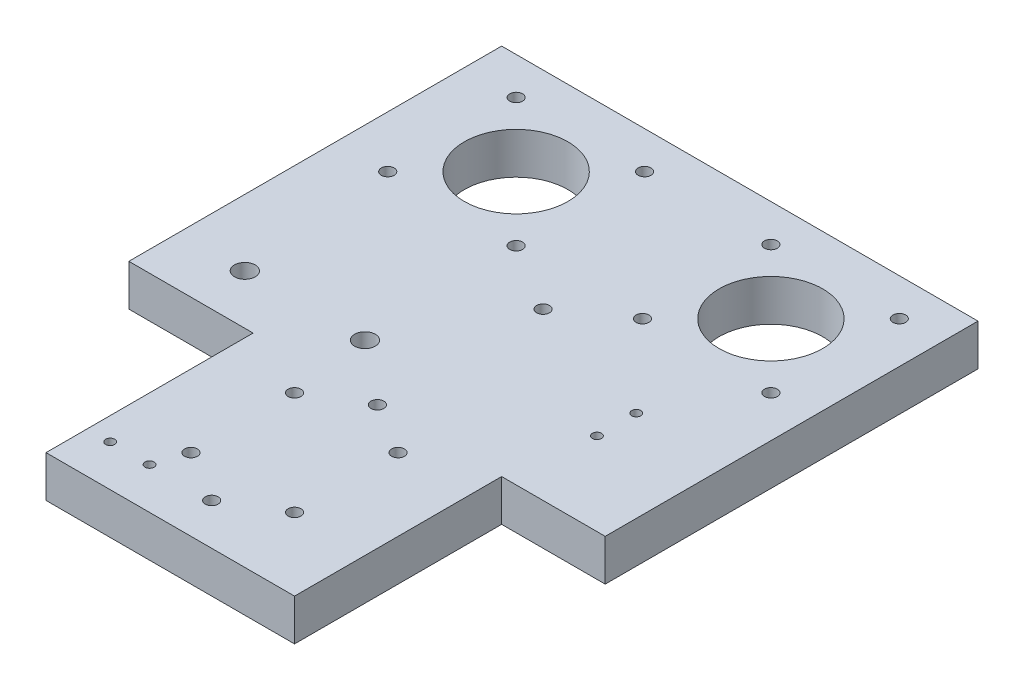
ISO-10303-21;
HEADER;
FILE_DESCRIPTION(('STEP AP214'),'2;1');
FILE_NAME('part.step','',(''),(''),'','','');
FILE_SCHEMA(('AUTOMOTIVE_DESIGN { 1 0 10303 214 1 1 1 1 }'));
ENDSEC;
DATA;
#1=APPLICATION_CONTEXT('core data for automotive mechanical design processes');
#2=APPLICATION_PROTOCOL_DEFINITION('international standard','automotive_design',2000,#1);
#3=PRODUCT_CONTEXT('',#1,'mechanical');
#4=PRODUCT('Part','Part','',(#3));
#5=PRODUCT_RELATED_PRODUCT_CATEGORY('part','',(#4));
#6=PRODUCT_DEFINITION_FORMATION('','',#4);
#7=PRODUCT_DEFINITION_CONTEXT('part definition',#1,'design');
#8=PRODUCT_DEFINITION('design','',#6,#7);
#9=PRODUCT_DEFINITION_SHAPE('','',#8);
#10=(LENGTH_UNIT() NAMED_UNIT(*) SI_UNIT(.MILLI.,.METRE.));
#11=(NAMED_UNIT(*) PLANE_ANGLE_UNIT() SI_UNIT($,.RADIAN.));
#12=(NAMED_UNIT(*) SI_UNIT($,.STERADIAN.) SOLID_ANGLE_UNIT());
#13=UNCERTAINTY_MEASURE_WITH_UNIT(LENGTH_MEASURE(1.E-05),#10,'distance_accuracy_value','');
#14=(GEOMETRIC_REPRESENTATION_CONTEXT(3) GLOBAL_UNCERTAINTY_ASSIGNED_CONTEXT((#13)) GLOBAL_UNIT_ASSIGNED_CONTEXT((#10,
#11,#12)) REPRESENTATION_CONTEXT('',''));
#15=CARTESIAN_POINT('',(0.,0.,0.));
#16=DIRECTION('',(0.,0.,1.));
#17=DIRECTION('',(1.,0.,0.));
#18=AXIS2_PLACEMENT_3D('',#15,#16,#17);
#19=CARTESIAN_POINT('',(-30.,10.,70.));
#20=DIRECTION('',(1.,0.,0.));
#21=DIRECTION('',(0.,0.,-1.));
#22=AXIS2_PLACEMENT_3D('',#19,#20,#21);
#23=PLANE('',#22);
#24=DIRECTION('',(0.,1.,0.));
#25=VECTOR('',#24,1.);
#26=CARTESIAN_POINT('',(-30.,-94.8683298050514,20.));
#27=LINE('',#26,#25);
#28=CARTESIAN_POINT('',(-30.,0.,20.));
#29=VERTEX_POINT('',#28);
#30=CARTESIAN_POINT('',(-30.,10.,20.));
#31=VERTEX_POINT('',#30);
#32=EDGE_CURVE('E47',#29,#31,#27,.T.);
#33=ORIENTED_EDGE('',*,*,#32,.F.);
#34=DIRECTION('',(0.,0.,1.));
#35=VECTOR('',#34,1.);
#36=CARTESIAN_POINT('',(-30.,0.,70.));
#37=LINE('',#36,#35);
#38=CARTESIAN_POINT('',(-30.,0.,70.));
#39=VERTEX_POINT('',#38);
#40=EDGE_CURVE('E108',#29,#39,#37,.T.);
#41=ORIENTED_EDGE('',*,*,#40,.T.);
#42=DIRECTION('',(0.,-1.,0.));
#43=VECTOR('',#42,1.);
#44=CARTESIAN_POINT('',(-30.,10.,70.));
#45=LINE('',#44,#43);
#46=CARTESIAN_POINT('',(-30.,10.,70.));
#47=VERTEX_POINT('',#46);
#48=EDGE_CURVE('E11',#47,#39,#45,.T.);
#49=ORIENTED_EDGE('',*,*,#48,.F.);
#50=DIRECTION('',(0.,0.,1.));
#51=VECTOR('',#50,1.);
#52=CARTESIAN_POINT('',(-30.,10.,70.));
#53=LINE('',#52,#51);
#54=EDGE_CURVE('E223',#31,#47,#53,.T.);
#55=ORIENTED_EDGE('',*,*,#54,.F.);
#56=EDGE_LOOP('',(#33,#41,#49,#55));
#57=FACE_BOUND('',#56,.T.);
#58=ADVANCED_FACE('F32',(#57),#23,.F.);
#59=CARTESIAN_POINT('',(30.,10.,70.));
#60=DIRECTION('',(-1.,0.,0.));
#61=DIRECTION('',(0.,0.,1.));
#62=AXIS2_PLACEMENT_3D('',#59,#60,#61);
#63=PLANE('',#62);
#64=DIRECTION('',(0.,0.,-1.));
#65=VECTOR('',#64,1.);
#66=CARTESIAN_POINT('',(30.,0.,70.));
#67=LINE('',#66,#65);
#68=CARTESIAN_POINT('',(30.,0.,70.));
#69=VERTEX_POINT('',#68);
#70=CARTESIAN_POINT('',(30.,0.,20.));
#71=VERTEX_POINT('',#70);
#72=EDGE_CURVE('E109',#69,#71,#67,.T.);
#73=ORIENTED_EDGE('',*,*,#72,.T.);
#74=DIRECTION('',(0.,1.,0.));
#75=VECTOR('',#74,1.);
#76=CARTESIAN_POINT('',(30.,-93.407708461347,20.));
#77=LINE('',#76,#75);
#78=CARTESIAN_POINT('',(30.,10.,20.));
#79=VERTEX_POINT('',#78);
#80=EDGE_CURVE('E172',#71,#79,#77,.T.);
#81=ORIENTED_EDGE('',*,*,#80,.T.);
#82=DIRECTION('',(0.,0.,-1.));
#83=VECTOR('',#82,1.);
#84=CARTESIAN_POINT('',(30.,10.,70.));
#85=LINE('',#84,#83);
#86=CARTESIAN_POINT('',(30.,10.,70.));
#87=VERTEX_POINT('',#86);
#88=EDGE_CURVE('E217',#87,#79,#85,.T.);
#89=ORIENTED_EDGE('',*,*,#88,.F.);
#90=DIRECTION('',(0.,-1.,0.));
#91=VECTOR('',#90,1.);
#92=CARTESIAN_POINT('',(30.,10.,70.));
#93=LINE('',#92,#91);
#94=EDGE_CURVE('E40',#87,#69,#93,.T.);
#95=ORIENTED_EDGE('',*,*,#94,.T.);
#96=EDGE_LOOP('',(#73,#81,#89,#95));
#97=FACE_BOUND('',#96,.T.);
#98=ADVANCED_FACE('F34',(#97),#63,.F.);
#99=CARTESIAN_POINT('',(-30.,10.,-70.));
#100=DIRECTION('',(0.,0.,1.));
#101=DIRECTION('',(1.,0.,0.));
#102=AXIS2_PLACEMENT_3D('',#99,#100,#101);
#103=PLANE('',#102);
#104=DIRECTION('',(-1.,0.,0.));
#105=VECTOR('',#104,1.);
#106=CARTESIAN_POINT('',(-30.,0.,-70.));
#107=LINE('',#106,#105);
#108=CARTESIAN_POINT('',(55.,0.,-70.));
#109=VERTEX_POINT('',#108);
#110=CARTESIAN_POINT('',(-60.,0.,-70.));
#111=VERTEX_POINT('',#110);
#112=EDGE_CURVE('E98',#109,#111,#107,.T.);
#113=ORIENTED_EDGE('',*,*,#112,.T.);
#114=DIRECTION('',(0.,1.,0.));
#115=VECTOR('',#114,1.);
#116=CARTESIAN_POINT('',(-60.,-94.8683298050514,-70.));
#117=LINE('',#116,#115);
#118=CARTESIAN_POINT('',(-60.,10.,-70.));
#119=VERTEX_POINT('',#118);
#120=EDGE_CURVE('E102',#111,#119,#117,.T.);
#121=ORIENTED_EDGE('',*,*,#120,.T.);
#122=DIRECTION('',(-1.,0.,0.));
#123=VECTOR('',#122,1.);
#124=CARTESIAN_POINT('',(-30.,10.,-70.));
#125=LINE('',#124,#123);
#126=CARTESIAN_POINT('',(55.,10.,-70.));
#127=VERTEX_POINT('',#126);
#128=EDGE_CURVE('E220',#127,#119,#125,.T.);
#129=ORIENTED_EDGE('',*,*,#128,.F.);
#130=DIRECTION('',(0.,1.,0.));
#131=VECTOR('',#130,1.);
#132=CARTESIAN_POINT('',(55.,-93.407708461347,-70.));
#133=LINE('',#132,#131);
#134=EDGE_CURVE('E105',#109,#127,#133,.T.);
#135=ORIENTED_EDGE('',*,*,#134,.F.);
#136=EDGE_LOOP('',(#113,#121,#129,#135));
#137=FACE_BOUND('',#136,.T.);
#138=ADVANCED_FACE('F100',(#137),#103,.F.);
#139=CARTESIAN_POINT('',(-30.,10.,70.));
#140=DIRECTION('',(0.,0.,-1.));
#141=DIRECTION('',(-1.,0.,0.));
#142=AXIS2_PLACEMENT_3D('',#139,#140,#141);
#143=PLANE('',#142);
#144=DIRECTION('',(1.,0.,0.));
#145=VECTOR('',#144,1.);
#146=CARTESIAN_POINT('',(-30.,0.,70.));
#147=LINE('',#146,#145);
#148=EDGE_CURVE('E221',#39,#69,#147,.T.);
#149=ORIENTED_EDGE('',*,*,#148,.T.);
#150=ORIENTED_EDGE('',*,*,#94,.F.);
#151=DIRECTION('',(1.,0.,0.));
#152=VECTOR('',#151,1.);
#153=CARTESIAN_POINT('',(-30.,10.,70.));
#154=LINE('',#153,#152);
#155=EDGE_CURVE('E225',#47,#87,#154,.T.);
#156=ORIENTED_EDGE('',*,*,#155,.F.);
#157=ORIENTED_EDGE('',*,*,#48,.T.);
#158=EDGE_LOOP('',(#149,#150,#156,#157));
#159=FACE_BOUND('',#158,.T.);
#160=ADVANCED_FACE('F242',(#159),#143,.F.);
#161=CARTESIAN_POINT('',(0.,10.,0.));
#162=DIRECTION('',(0.,-1.,0.));
#163=DIRECTION('',(0.,0.,-1.));
#164=AXIS2_PLACEMENT_3D('',#161,#162,#163);
#165=PLANE('',#164);
#166=CARTESIAN_POINT('',(33.,10.,-9.50000000000001));
#167=DIRECTION('',(0.,-1.,0.));
#168=DIRECTION('',(0.,0.,-1.));
#169=AXIS2_PLACEMENT_3D('',#166,#167,#168);
#170=CIRCLE('',#169,1.1);
#171=CARTESIAN_POINT('',(33.,10.,-10.6));
#172=VERTEX_POINT('',#171);
#173=EDGE_CURVE('E296',#172,#172,#170,.F.);
#174=ORIENTED_EDGE('',*,*,#173,.F.);
#175=EDGE_LOOP('',(#174));
#176=FACE_BOUND('',#175,.T.);
#177=CARTESIAN_POINT('',(33.,10.,0.));
#178=DIRECTION('',(0.,-1.,0.));
#179=DIRECTION('',(0.,0.,-1.));
#180=AXIS2_PLACEMENT_3D('',#177,#178,#179);
#181=CIRCLE('',#180,1.1);
#182=CARTESIAN_POINT('',(33.,10.,-1.10000000000001));
#183=VERTEX_POINT('',#182);
#184=EDGE_CURVE('E304',#183,#183,#181,.F.);
#185=ORIENTED_EDGE('',*,*,#184,.F.);
#186=EDGE_LOOP('',(#185));
#187=FACE_BOUND('',#186,.T.);
#188=CARTESIAN_POINT('',(-24.5,10.,60.));
#189=DIRECTION('',(0.,1.,0.));
#190=DIRECTION('',(0.,0.,1.));
#191=AXIS2_PLACEMENT_3D('',#188,#189,#190);
#192=CIRCLE('',#191,1.1);
#193=CARTESIAN_POINT('',(-24.5,10.,61.1));
#194=VERTEX_POINT('',#193);
#195=EDGE_CURVE('E299',#194,#194,#192,.T.);
#196=ORIENTED_EDGE('',*,*,#195,.F.);
#197=EDGE_LOOP('',(#196));
#198=FACE_BOUND('',#197,.T.);
#199=CARTESIAN_POINT('',(-15.,10.,60.));
#200=DIRECTION('',(0.,1.,0.));
#201=DIRECTION('',(0.,0.,1.));
#202=AXIS2_PLACEMENT_3D('',#199,#200,#201);
#203=CIRCLE('',#202,1.1);
#204=CARTESIAN_POINT('',(-15.,10.,61.1));
#205=VERTEX_POINT('',#204);
#206=EDGE_CURVE('E292',#205,#205,#203,.T.);
#207=ORIENTED_EDGE('',*,*,#206,.F.);
#208=EDGE_LOOP('',(#207));
#209=FACE_BOUND('',#208,.T.);
#210=CARTESIAN_POINT('',(-44.,10.,8.00000000000001));
#211=DIRECTION('',(0.,1.,0.));
#212=DIRECTION('',(0.,0.,1.));
#213=AXIS2_PLACEMENT_3D('',#210,#211,#212);
#214=CIRCLE('',#213,2.49999999999999);
#215=CARTESIAN_POINT('',(-44.,10.,10.5));
#216=VERTEX_POINT('',#215);
#217=EDGE_CURVE('E287',#216,#216,#214,.T.);
#218=ORIENTED_EDGE('',*,*,#217,.F.);
#219=EDGE_LOOP('',(#218));
#220=FACE_BOUND('',#219,.T.);
#221=CARTESIAN_POINT('',(-15.,10.,8.));
#222=DIRECTION('',(0.,1.,0.));
#223=DIRECTION('',(0.,0.,1.));
#224=AXIS2_PLACEMENT_3D('',#221,#222,#223);
#225=CIRCLE('',#224,2.49999999999998);
#226=CARTESIAN_POINT('',(-15.,10.,10.5));
#227=VERTEX_POINT('',#226);
#228=EDGE_CURVE('E280',#227,#227,#225,.T.);
#229=ORIENTED_EDGE('',*,*,#228,.F.);
#230=EDGE_LOOP('',(#229));
#231=FACE_BOUND('',#230,.T.);
#232=CARTESIAN_POINT('',(-32.,10.,-45.5));
#233=DIRECTION('',(0.,1.,0.));
#234=DIRECTION('',(0.,0.,1.));
#235=AXIS2_PLACEMENT_3D('',#232,#233,#234);
#236=CIRCLE('',#235,12.5);
#237=CARTESIAN_POINT('',(-32.,10.,-33.));
#238=VERTEX_POINT('',#237);
#239=EDGE_CURVE('E256',#238,#238,#236,.T.);
#240=ORIENTED_EDGE('',*,*,#239,.F.);
#241=EDGE_LOOP('',(#240));
#242=FACE_BOUND('',#241,.T.);
#243=CARTESIAN_POINT('',(-47.5,10.,-30.));
#244=DIRECTION('',(0.,1.,0.));
#245=DIRECTION('',(0.,0.,1.));
#246=AXIS2_PLACEMENT_3D('',#243,#244,#245);
#247=CIRCLE('',#246,1.55);
#248=CARTESIAN_POINT('',(-47.5,10.,-28.45));
#249=VERTEX_POINT('',#248);
#250=EDGE_CURVE('E263',#249,#249,#247,.T.);
#251=ORIENTED_EDGE('',*,*,#250,.F.);
#252=EDGE_LOOP('',(#251));
#253=FACE_BOUND('',#252,.T.);
#254=CARTESIAN_POINT('',(-16.5,10.,-30.));
#255=DIRECTION('',(0.,1.,0.));
#256=DIRECTION('',(0.,0.,1.));
#257=AXIS2_PLACEMENT_3D('',#254,#255,#256);
#258=CIRCLE('',#257,1.55);
#259=CARTESIAN_POINT('',(-16.5,10.,-28.45));
#260=VERTEX_POINT('',#259);
#261=EDGE_CURVE('E269',#260,#260,#258,.T.);
#262=ORIENTED_EDGE('',*,*,#261,.F.);
#263=EDGE_LOOP('',(#262));
#264=FACE_BOUND('',#263,.T.);
#265=CARTESIAN_POINT('',(-16.5,10.,-61.));
#266=DIRECTION('',(0.,1.,0.));
#267=DIRECTION('',(0.,0.,1.));
#268=AXIS2_PLACEMENT_3D('',#265,#266,#267);
#269=CIRCLE('',#268,1.55);
#270=CARTESIAN_POINT('',(-16.5,10.,-59.45));
#271=VERTEX_POINT('',#270);
#272=EDGE_CURVE('E275',#271,#271,#269,.T.);
#273=ORIENTED_EDGE('',*,*,#272,.F.);
#274=EDGE_LOOP('',(#273));
#275=FACE_BOUND('',#274,.T.);
#276=CARTESIAN_POINT('',(-47.5,10.,-61.));
#277=DIRECTION('',(0.,1.,0.));
#278=DIRECTION('',(0.,0.,1.));
#279=AXIS2_PLACEMENT_3D('',#276,#277,#278);
#280=CIRCLE('',#279,1.55);
#281=CARTESIAN_POINT('',(-47.5,10.,-59.45));
#282=VERTEX_POINT('',#281);
#283=EDGE_CURVE('E250',#282,#282,#280,.T.);
#284=ORIENTED_EDGE('',*,*,#283,.F.);
#285=EDGE_LOOP('',(#284));
#286=FACE_BOUND('',#285,.T.);
#287=CARTESIAN_POINT('',(29.5,10.,-45.5));
#288=DIRECTION('',(0.,1.,0.));
#289=DIRECTION('',(0.,0.,1.));
#290=AXIS2_PLACEMENT_3D('',#287,#288,#289);
#291=CIRCLE('',#290,12.5);
#292=CARTESIAN_POINT('',(29.5,10.,-33.));
#293=VERTEX_POINT('',#292);
#294=EDGE_CURVE('E153',#293,#293,#291,.T.);
#295=ORIENTED_EDGE('',*,*,#294,.F.);
#296=EDGE_LOOP('',(#295));
#297=FACE_BOUND('',#296,.T.);
#298=CARTESIAN_POINT('',(14.,10.,-61.));
#299=DIRECTION('',(0.,1.,0.));
#300=DIRECTION('',(0.,0.,1.));
#301=AXIS2_PLACEMENT_3D('',#298,#299,#300);
#302=CIRCLE('',#301,1.55);
#303=CARTESIAN_POINT('',(14.,10.,-59.45));
#304=VERTEX_POINT('',#303);
#305=EDGE_CURVE('E147',#304,#304,#302,.T.);
#306=ORIENTED_EDGE('',*,*,#305,.F.);
#307=EDGE_LOOP('',(#306));
#308=FACE_BOUND('',#307,.T.);
#309=CARTESIAN_POINT('',(45.,10.,-61.));
#310=DIRECTION('',(0.,1.,0.));
#311=DIRECTION('',(0.,0.,1.));
#312=AXIS2_PLACEMENT_3D('',#309,#310,#311);
#313=CIRCLE('',#312,1.55);
#314=CARTESIAN_POINT('',(45.,10.,-59.45));
#315=VERTEX_POINT('',#314);
#316=EDGE_CURVE('E141',#315,#315,#313,.T.);
#317=ORIENTED_EDGE('',*,*,#316,.F.);
#318=EDGE_LOOP('',(#317));
#319=FACE_BOUND('',#318,.T.);
#320=CARTESIAN_POINT('',(45.,10.,-30.));
#321=DIRECTION('',(0.,1.,0.));
#322=DIRECTION('',(0.,0.,1.));
#323=AXIS2_PLACEMENT_3D('',#320,#321,#322);
#324=CIRCLE('',#323,1.55);
#325=CARTESIAN_POINT('',(45.,10.,-28.45));
#326=VERTEX_POINT('',#325);
#327=EDGE_CURVE('E135',#326,#326,#324,.T.);
#328=ORIENTED_EDGE('',*,*,#327,.F.);
#329=EDGE_LOOP('',(#328));
#330=FACE_BOUND('',#329,.T.);
#331=CARTESIAN_POINT('',(14.,10.,-30.));
#332=DIRECTION('',(0.,1.,0.));
#333=DIRECTION('',(0.,0.,1.));
#334=AXIS2_PLACEMENT_3D('',#331,#332,#333);
#335=CIRCLE('',#334,1.55);
#336=CARTESIAN_POINT('',(14.,10.,-28.45));
#337=VERTEX_POINT('',#336);
#338=EDGE_CURVE('E134',#337,#337,#335,.T.);
#339=ORIENTED_EDGE('',*,*,#338,.F.);
#340=EDGE_LOOP('',(#339));
#341=FACE_BOUND('',#340,.T.);
#342=CARTESIAN_POINT('',(12.5,10.,52.5));
#343=DIRECTION('',(0.,1.,0.));
#344=DIRECTION('',(0.,0.,1.));
#345=AXIS2_PLACEMENT_3D('',#342,#343,#344);
#346=CIRCLE('',#345,1.55);
#347=CARTESIAN_POINT('',(12.5,10.,54.05));
#348=VERTEX_POINT('',#347);
#349=EDGE_CURVE('E186',#348,#348,#346,.T.);
#350=ORIENTED_EDGE('',*,*,#349,.F.);
#351=EDGE_LOOP('',(#350));
#352=FACE_BOUND('',#351,.T.);
#353=CARTESIAN_POINT('',(-12.5,10.,27.5));
#354=DIRECTION('',(0.,1.,0.));
#355=DIRECTION('',(0.,0.,1.));
#356=AXIS2_PLACEMENT_3D('',#353,#354,#355);
#357=CIRCLE('',#356,1.55);
#358=CARTESIAN_POINT('',(-12.5,10.,29.05));
#359=VERTEX_POINT('',#358);
#360=EDGE_CURVE('E179',#359,#359,#357,.T.);
#361=ORIENTED_EDGE('',*,*,#360,.F.);
#362=EDGE_LOOP('',(#361));
#363=FACE_BOUND('',#362,.T.);
#364=CARTESIAN_POINT('',(-12.5,10.,52.5));
#365=DIRECTION('',(0.,1.,0.));
#366=DIRECTION('',(0.,0.,1.));
#367=AXIS2_PLACEMENT_3D('',#364,#365,#366);
#368=CIRCLE('',#367,1.55);
#369=CARTESIAN_POINT('',(-12.5,10.,54.05));
#370=VERTEX_POINT('',#369);
#371=EDGE_CURVE('E175',#370,#370,#368,.T.);
#372=ORIENTED_EDGE('',*,*,#371,.F.);
#373=EDGE_LOOP('',(#372));
#374=FACE_BOUND('',#373,.T.);
#375=CARTESIAN_POINT('',(12.5,10.,27.5));
#376=DIRECTION('',(0.,1.,0.));
#377=DIRECTION('',(0.,0.,1.));
#378=AXIS2_PLACEMENT_3D('',#375,#376,#377);
#379=CIRCLE('',#378,1.55);
#380=CARTESIAN_POINT('',(12.5,10.,29.05));
#381=VERTEX_POINT('',#380);
#382=EDGE_CURVE('E185',#381,#381,#379,.T.);
#383=ORIENTED_EDGE('',*,*,#382,.F.);
#384=EDGE_LOOP('',(#383));
#385=FACE_BOUND('',#384,.T.);
#386=CARTESIAN_POINT('',(0.,10.,60.));
#387=DIRECTION('',(0.,1.,0.));
#388=DIRECTION('',(0.,0.,1.));
#389=AXIS2_PLACEMENT_3D('',#386,#387,#388);
#390=CIRCLE('',#389,1.55);
#391=CARTESIAN_POINT('',(0.,10.,61.55));
#392=VERTEX_POINT('',#391);
#393=EDGE_CURVE('E203',#392,#392,#390,.T.);
#394=ORIENTED_EDGE('',*,*,#393,.F.);
#395=EDGE_LOOP('',(#394));
#396=FACE_BOUND('',#395,.T.);
#397=CARTESIAN_POINT('',(0.,10.,20.));
#398=DIRECTION('',(0.,1.,0.));
#399=DIRECTION('',(0.,0.,1.));
#400=AXIS2_PLACEMENT_3D('',#397,#398,#399);
#401=CIRCLE('',#400,1.55);
#402=CARTESIAN_POINT('',(0.,10.,21.55));
#403=VERTEX_POINT('',#402);
#404=EDGE_CURVE('E209',#403,#403,#401,.T.);
#405=ORIENTED_EDGE('',*,*,#404,.F.);
#406=EDGE_LOOP('',(#405));
#407=FACE_BOUND('',#406,.T.);
#408=CARTESIAN_POINT('',(0.,10.,-20.));
#409=DIRECTION('',(0.,1.,0.));
#410=DIRECTION('',(0.,0.,1.));
#411=AXIS2_PLACEMENT_3D('',#408,#409,#410);
#412=CIRCLE('',#411,1.55);
#413=CARTESIAN_POINT('',(0.,10.,-18.45));
#414=VERTEX_POINT('',#413);
#415=EDGE_CURVE('E197',#414,#414,#412,.T.);
#416=ORIENTED_EDGE('',*,*,#415,.F.);
#417=EDGE_LOOP('',(#416));
#418=FACE_BOUND('',#417,.T.);
#419=ORIENTED_EDGE('',*,*,#88,.T.);
#420=DIRECTION('',(1.,0.,0.));
#421=VECTOR('',#420,1.);
#422=CARTESIAN_POINT('',(30.,10.,20.));
#423=LINE('',#422,#421);
#424=CARTESIAN_POINT('',(55.,10.,20.));
#425=VERTEX_POINT('',#424);
#426=EDGE_CURVE('E55',#79,#425,#423,.T.);
#427=ORIENTED_EDGE('',*,*,#426,.T.);
#428=DIRECTION('',(0.,0.,-1.));
#429=VECTOR('',#428,1.);
#430=CARTESIAN_POINT('',(55.,10.,-70.));
#431=LINE('',#430,#429);
#432=EDGE_CURVE('E161',#425,#127,#431,.T.);
#433=ORIENTED_EDGE('',*,*,#432,.T.);
#434=ORIENTED_EDGE('',*,*,#128,.T.);
#435=DIRECTION('',(0.,0.,1.));
#436=VECTOR('',#435,1.);
#437=CARTESIAN_POINT('',(-60.,10.,-70.));
#438=LINE('',#437,#436);
#439=CARTESIAN_POINT('',(-60.,10.,20.));
#440=VERTEX_POINT('',#439);
#441=EDGE_CURVE('E123',#119,#440,#438,.T.);
#442=ORIENTED_EDGE('',*,*,#441,.T.);
#443=DIRECTION('',(1.,0.,0.));
#444=VECTOR('',#443,1.);
#445=CARTESIAN_POINT('',(-30.,10.,20.));
#446=LINE('',#445,#444);
#447=EDGE_CURVE('E124',#440,#31,#446,.T.);
#448=ORIENTED_EDGE('',*,*,#447,.T.);
#449=ORIENTED_EDGE('',*,*,#54,.T.);
#450=ORIENTED_EDGE('',*,*,#155,.T.);
#451=EDGE_LOOP('',(#419,#427,#433,#434,#442,#448,#449,#450));
#452=FACE_BOUND('',#451,.T.);
#453=ADVANCED_FACE('F240',(#176,#187,#198,#209,#220,#231,#242,#253,#264,#275,#286,#297,#308,
#319,#330,#341,#352,#363,#374,#385,#396,#407,#418,#452),#165,.F.);
#454=CARTESIAN_POINT('',(0.,0.,0.));
#455=DIRECTION('',(0.,-1.,0.));
#456=DIRECTION('',(0.,0.,-1.));
#457=AXIS2_PLACEMENT_3D('',#454,#455,#456);
#458=PLANE('',#457);
#459=CARTESIAN_POINT('',(33.,0.,-9.50000000000001));
#460=DIRECTION('',(0.,-1.,0.));
#461=DIRECTION('',(0.,0.,-1.));
#462=AXIS2_PLACEMENT_3D('',#459,#460,#461);
#463=CIRCLE('',#462,1.1);
#464=CARTESIAN_POINT('',(33.,0.,-10.6));
#465=VERTEX_POINT('',#464);
#466=EDGE_CURVE('E307',#465,#465,#463,.T.);
#467=ORIENTED_EDGE('',*,*,#466,.F.);
#468=EDGE_LOOP('',(#467));
#469=FACE_BOUND('',#468,.T.);
#470=CARTESIAN_POINT('',(33.,0.,0.));
#471=DIRECTION('',(0.,-1.,0.));
#472=DIRECTION('',(0.,0.,-1.));
#473=AXIS2_PLACEMENT_3D('',#470,#471,#472);
#474=CIRCLE('',#473,1.1);
#475=CARTESIAN_POINT('',(33.,0.,-1.10000000000001));
#476=VERTEX_POINT('',#475);
#477=EDGE_CURVE('E308',#476,#476,#474,.T.);
#478=ORIENTED_EDGE('',*,*,#477,.F.);
#479=EDGE_LOOP('',(#478));
#480=FACE_BOUND('',#479,.T.);
#481=CARTESIAN_POINT('',(-24.5,0.,60.));
#482=DIRECTION('',(0.,1.,0.));
#483=DIRECTION('',(0.,0.,1.));
#484=AXIS2_PLACEMENT_3D('',#481,#482,#483);
#485=CIRCLE('',#484,1.1);
#486=CARTESIAN_POINT('',(-24.5,0.,61.1));
#487=VERTEX_POINT('',#486);
#488=EDGE_CURVE('E284',#487,#487,#485,.T.);
#489=ORIENTED_EDGE('',*,*,#488,.T.);
#490=EDGE_LOOP('',(#489));
#491=FACE_BOUND('',#490,.T.);
#492=CARTESIAN_POINT('',(-15.,0.,60.));
#493=DIRECTION('',(0.,1.,0.));
#494=DIRECTION('',(0.,0.,1.));
#495=AXIS2_PLACEMENT_3D('',#492,#493,#494);
#496=CIRCLE('',#495,1.1);
#497=CARTESIAN_POINT('',(-15.,0.,61.1));
#498=VERTEX_POINT('',#497);
#499=EDGE_CURVE('E295',#498,#498,#496,.T.);
#500=ORIENTED_EDGE('',*,*,#499,.T.);
#501=EDGE_LOOP('',(#500));
#502=FACE_BOUND('',#501,.T.);
#503=CARTESIAN_POINT('',(-44.,0.,8.00000000000001));
#504=DIRECTION('',(0.,1.,0.));
#505=DIRECTION('',(0.,0.,1.));
#506=AXIS2_PLACEMENT_3D('',#503,#504,#505);
#507=CIRCLE('',#506,2.49999999999999);
#508=CARTESIAN_POINT('',(-44.,0.,10.5));
#509=VERTEX_POINT('',#508);
#510=EDGE_CURVE('E260',#509,#509,#507,.T.);
#511=ORIENTED_EDGE('',*,*,#510,.T.);
#512=EDGE_LOOP('',(#511));
#513=FACE_BOUND('',#512,.T.);
#514=CARTESIAN_POINT('',(-15.,0.,8.));
#515=DIRECTION('',(0.,1.,0.));
#516=DIRECTION('',(0.,0.,1.));
#517=AXIS2_PLACEMENT_3D('',#514,#515,#516);
#518=CIRCLE('',#517,2.49999999999998);
#519=CARTESIAN_POINT('',(-15.,0.,10.5));
#520=VERTEX_POINT('',#519);
#521=EDGE_CURVE('E283',#520,#520,#518,.T.);
#522=ORIENTED_EDGE('',*,*,#521,.T.);
#523=EDGE_LOOP('',(#522));
#524=FACE_BOUND('',#523,.T.);
#525=CARTESIAN_POINT('',(-32.,0.,-45.5));
#526=DIRECTION('',(0.,1.,0.));
#527=DIRECTION('',(0.,0.,1.));
#528=AXIS2_PLACEMENT_3D('',#525,#526,#527);
#529=CIRCLE('',#528,12.5);
#530=CARTESIAN_POINT('',(-32.,0.,-33.));
#531=VERTEX_POINT('',#530);
#532=EDGE_CURVE('E259',#531,#531,#529,.T.);
#533=ORIENTED_EDGE('',*,*,#532,.T.);
#534=EDGE_LOOP('',(#533));
#535=FACE_BOUND('',#534,.T.);
#536=CARTESIAN_POINT('',(-47.5,0.,-30.));
#537=DIRECTION('',(0.,1.,0.));
#538=DIRECTION('',(0.,0.,1.));
#539=AXIS2_PLACEMENT_3D('',#536,#537,#538);
#540=CIRCLE('',#539,1.55);
#541=CARTESIAN_POINT('',(-47.5,0.,-28.45));
#542=VERTEX_POINT('',#541);
#543=EDGE_CURVE('E266',#542,#542,#540,.T.);
#544=ORIENTED_EDGE('',*,*,#543,.T.);
#545=EDGE_LOOP('',(#544));
#546=FACE_BOUND('',#545,.T.);
#547=CARTESIAN_POINT('',(-16.5,0.,-30.));
#548=DIRECTION('',(0.,1.,0.));
#549=DIRECTION('',(0.,0.,1.));
#550=AXIS2_PLACEMENT_3D('',#547,#548,#549);
#551=CIRCLE('',#550,1.55);
#552=CARTESIAN_POINT('',(-16.5,0.,-28.45));
#553=VERTEX_POINT('',#552);
#554=EDGE_CURVE('E272',#553,#553,#551,.T.);
#555=ORIENTED_EDGE('',*,*,#554,.T.);
#556=EDGE_LOOP('',(#555));
#557=FACE_BOUND('',#556,.T.);
#558=CARTESIAN_POINT('',(-16.5,0.,-61.));
#559=DIRECTION('',(0.,1.,0.));
#560=DIRECTION('',(0.,0.,1.));
#561=AXIS2_PLACEMENT_3D('',#558,#559,#560);
#562=CIRCLE('',#561,1.55);
#563=CARTESIAN_POINT('',(-16.5,0.,-59.45));
#564=VERTEX_POINT('',#563);
#565=EDGE_CURVE('E253',#564,#564,#562,.T.);
#566=ORIENTED_EDGE('',*,*,#565,.T.);
#567=EDGE_LOOP('',(#566));
#568=FACE_BOUND('',#567,.T.);
#569=CARTESIAN_POINT('',(-47.5,0.,-61.));
#570=DIRECTION('',(0.,1.,0.));
#571=DIRECTION('',(0.,0.,1.));
#572=AXIS2_PLACEMENT_3D('',#569,#570,#571);
#573=CIRCLE('',#572,1.55);
#574=CARTESIAN_POINT('',(-47.5,0.,-59.45));
#575=VERTEX_POINT('',#574);
#576=EDGE_CURVE('E248',#575,#575,#573,.T.);
#577=ORIENTED_EDGE('',*,*,#576,.T.);
#578=EDGE_LOOP('',(#577));
#579=FACE_BOUND('',#578,.T.);
#580=CARTESIAN_POINT('',(29.5,0.,-45.5));
#581=DIRECTION('',(0.,1.,0.));
#582=DIRECTION('',(0.,0.,1.));
#583=AXIS2_PLACEMENT_3D('',#580,#581,#582);
#584=CIRCLE('',#583,12.5);
#585=CARTESIAN_POINT('',(29.5,0.,-33.));
#586=VERTEX_POINT('',#585);
#587=EDGE_CURVE('E150',#586,#586,#584,.T.);
#588=ORIENTED_EDGE('',*,*,#587,.T.);
#589=EDGE_LOOP('',(#588));
#590=FACE_BOUND('',#589,.T.);
#591=CARTESIAN_POINT('',(14.,0.,-61.));
#592=DIRECTION('',(0.,1.,0.));
#593=DIRECTION('',(0.,0.,1.));
#594=AXIS2_PLACEMENT_3D('',#591,#592,#593);
#595=CIRCLE('',#594,1.55);
#596=CARTESIAN_POINT('',(14.,0.,-59.45));
#597=VERTEX_POINT('',#596);
#598=EDGE_CURVE('E144',#597,#597,#595,.T.);
#599=ORIENTED_EDGE('',*,*,#598,.T.);
#600=EDGE_LOOP('',(#599));
#601=FACE_BOUND('',#600,.T.);
#602=CARTESIAN_POINT('',(45.,0.,-61.));
#603=DIRECTION('',(0.,1.,0.));
#604=DIRECTION('',(0.,0.,1.));
#605=AXIS2_PLACEMENT_3D('',#602,#603,#604);
#606=CIRCLE('',#605,1.55);
#607=CARTESIAN_POINT('',(45.,0.,-59.45));
#608=VERTEX_POINT('',#607);
#609=EDGE_CURVE('E138',#608,#608,#606,.T.);
#610=ORIENTED_EDGE('',*,*,#609,.T.);
#611=EDGE_LOOP('',(#610));
#612=FACE_BOUND('',#611,.T.);
#613=CARTESIAN_POINT('',(45.,0.,-30.));
#614=DIRECTION('',(0.,1.,0.));
#615=DIRECTION('',(0.,0.,1.));
#616=AXIS2_PLACEMENT_3D('',#613,#614,#615);
#617=CIRCLE('',#616,1.55);
#618=CARTESIAN_POINT('',(45.,0.,-28.45));
#619=VERTEX_POINT('',#618);
#620=EDGE_CURVE('E131',#619,#619,#617,.T.);
#621=ORIENTED_EDGE('',*,*,#620,.T.);
#622=EDGE_LOOP('',(#621));
#623=FACE_BOUND('',#622,.T.);
#624=CARTESIAN_POINT('',(14.,0.,-30.));
#625=DIRECTION('',(0.,1.,0.));
#626=DIRECTION('',(0.,0.,1.));
#627=AXIS2_PLACEMENT_3D('',#624,#625,#626);
#628=CIRCLE('',#627,1.55);
#629=CARTESIAN_POINT('',(14.,0.,-28.45));
#630=VERTEX_POINT('',#629);
#631=EDGE_CURVE('E156',#630,#630,#628,.T.);
#632=ORIENTED_EDGE('',*,*,#631,.T.);
#633=EDGE_LOOP('',(#632));
#634=FACE_BOUND('',#633,.T.);
#635=CARTESIAN_POINT('',(12.5,0.,52.5));
#636=DIRECTION('',(0.,1.,0.));
#637=DIRECTION('',(0.,0.,1.));
#638=AXIS2_PLACEMENT_3D('',#635,#636,#637);
#639=CIRCLE('',#638,1.55);
#640=CARTESIAN_POINT('',(12.5,0.,54.05));
#641=VERTEX_POINT('',#640);
#642=EDGE_CURVE('E182',#641,#641,#639,.T.);
#643=ORIENTED_EDGE('',*,*,#642,.T.);
#644=EDGE_LOOP('',(#643));
#645=FACE_BOUND('',#644,.T.);
#646=CARTESIAN_POINT('',(-12.5,0.,27.5));
#647=DIRECTION('',(0.,1.,0.));
#648=DIRECTION('',(0.,0.,1.));
#649=AXIS2_PLACEMENT_3D('',#646,#647,#648);
#650=CIRCLE('',#649,1.55);
#651=CARTESIAN_POINT('',(-12.5,0.,29.05));
#652=VERTEX_POINT('',#651);
#653=EDGE_CURVE('E189',#652,#652,#650,.T.);
#654=ORIENTED_EDGE('',*,*,#653,.T.);
#655=EDGE_LOOP('',(#654));
#656=FACE_BOUND('',#655,.T.);
#657=CARTESIAN_POINT('',(-12.5,0.,52.5));
#658=DIRECTION('',(0.,1.,0.));
#659=DIRECTION('',(0.,0.,1.));
#660=AXIS2_PLACEMENT_3D('',#657,#658,#659);
#661=CIRCLE('',#660,1.55);
#662=CARTESIAN_POINT('',(-12.5,0.,54.05));
#663=VERTEX_POINT('',#662);
#664=EDGE_CURVE('E176',#663,#663,#661,.T.);
#665=ORIENTED_EDGE('',*,*,#664,.T.);
#666=EDGE_LOOP('',(#665));
#667=FACE_BOUND('',#666,.T.);
#668=CARTESIAN_POINT('',(12.5,0.,27.5));
#669=DIRECTION('',(0.,1.,0.));
#670=DIRECTION('',(0.,0.,1.));
#671=AXIS2_PLACEMENT_3D('',#668,#669,#670);
#672=CIRCLE('',#671,1.55);
#673=CARTESIAN_POINT('',(12.5,0.,29.05));
#674=VERTEX_POINT('',#673);
#675=EDGE_CURVE('E194',#674,#674,#672,.T.);
#676=ORIENTED_EDGE('',*,*,#675,.T.);
#677=EDGE_LOOP('',(#676));
#678=FACE_BOUND('',#677,.T.);
#679=CARTESIAN_POINT('',(0.,0.,60.));
#680=DIRECTION('',(0.,1.,0.));
#681=DIRECTION('',(0.,0.,1.));
#682=AXIS2_PLACEMENT_3D('',#679,#680,#681);
#683=CIRCLE('',#682,1.55);
#684=CARTESIAN_POINT('',(0.,0.,61.55));
#685=VERTEX_POINT('',#684);
#686=EDGE_CURVE('E200',#685,#685,#683,.T.);
#687=ORIENTED_EDGE('',*,*,#686,.T.);
#688=EDGE_LOOP('',(#687));
#689=FACE_BOUND('',#688,.T.);
#690=CARTESIAN_POINT('',(0.,0.,20.));
#691=DIRECTION('',(0.,1.,0.));
#692=DIRECTION('',(0.,0.,1.));
#693=AXIS2_PLACEMENT_3D('',#690,#691,#692);
#694=CIRCLE('',#693,1.55);
#695=CARTESIAN_POINT('',(0.,0.,21.55));
#696=VERTEX_POINT('',#695);
#697=EDGE_CURVE('E206',#696,#696,#694,.T.);
#698=ORIENTED_EDGE('',*,*,#697,.T.);
#699=EDGE_LOOP('',(#698));
#700=FACE_BOUND('',#699,.T.);
#701=CARTESIAN_POINT('',(0.,0.,-20.));
#702=DIRECTION('',(0.,1.,0.));
#703=DIRECTION('',(0.,0.,1.));
#704=AXIS2_PLACEMENT_3D('',#701,#702,#703);
#705=CIRCLE('',#704,1.55);
#706=CARTESIAN_POINT('',(0.,0.,-18.45));
#707=VERTEX_POINT('',#706);
#708=EDGE_CURVE('E212',#707,#707,#705,.T.);
#709=ORIENTED_EDGE('',*,*,#708,.T.);
#710=EDGE_LOOP('',(#709));
#711=FACE_BOUND('',#710,.T.);
#712=ORIENTED_EDGE('',*,*,#72,.F.);
#713=ORIENTED_EDGE('',*,*,#148,.F.);
#714=ORIENTED_EDGE('',*,*,#40,.F.);
#715=DIRECTION('',(1.,0.,0.));
#716=VECTOR('',#715,1.);
#717=CARTESIAN_POINT('',(-30.,0.,20.));
#718=LINE('',#717,#716);
#719=CARTESIAN_POINT('',(-60.,0.,20.));
#720=VERTEX_POINT('',#719);
#721=EDGE_CURVE('E116',#720,#29,#718,.T.);
#722=ORIENTED_EDGE('',*,*,#721,.F.);
#723=DIRECTION('',(0.,0.,1.));
#724=VECTOR('',#723,1.);
#725=CARTESIAN_POINT('',(-60.,0.,-70.));
#726=LINE('',#725,#724);
#727=EDGE_CURVE('E112',#111,#720,#726,.T.);
#728=ORIENTED_EDGE('',*,*,#727,.F.);
#729=ORIENTED_EDGE('',*,*,#112,.F.);
#730=DIRECTION('',(0.,0.,-1.));
#731=VECTOR('',#730,1.);
#732=CARTESIAN_POINT('',(55.,0.,-70.));
#733=LINE('',#732,#731);
#734=CARTESIAN_POINT('',(55.,0.,20.));
#735=VERTEX_POINT('',#734);
#736=EDGE_CURVE('E169',#735,#109,#733,.T.);
#737=ORIENTED_EDGE('',*,*,#736,.F.);
#738=DIRECTION('',(1.,0.,0.));
#739=VECTOR('',#738,1.);
#740=CARTESIAN_POINT('',(30.,0.,20.));
#741=LINE('',#740,#739);
#742=EDGE_CURVE('E164',#71,#735,#741,.T.);
#743=ORIENTED_EDGE('',*,*,#742,.F.);
#744=EDGE_LOOP('',(#712,#713,#714,#722,#728,#729,#737,#743));
#745=FACE_BOUND('',#744,.T.);
#746=ADVANCED_FACE('F114',(#469,#480,#491,#502,#513,#524,#535,#546,#557,#568,#579,#590,#601,
#612,#623,#634,#645,#656,#667,#678,#689,#700,#711,#745),#458,.T.);
#747=CARTESIAN_POINT('',(0.,0.,-20.));
#748=DIRECTION('',(0.,1.,0.));
#749=DIRECTION('',(0.,0.,1.));
#750=AXIS2_PLACEMENT_3D('',#747,#748,#749);
#751=CYLINDRICAL_SURFACE('',#750,1.55);
#752=ORIENTED_EDGE('',*,*,#708,.F.);
#753=EDGE_LOOP('',(#752));
#754=FACE_BOUND('',#753,.T.);
#755=ORIENTED_EDGE('',*,*,#415,.T.);
#756=EDGE_LOOP('',(#755));
#757=FACE_BOUND('',#756,.T.);
#758=ADVANCED_FACE('F321',(#754,#757),#751,.F.);
#759=CARTESIAN_POINT('',(0.,0.,20.));
#760=DIRECTION('',(0.,1.,0.));
#761=DIRECTION('',(0.,0.,1.));
#762=AXIS2_PLACEMENT_3D('',#759,#760,#761);
#763=CYLINDRICAL_SURFACE('',#762,1.55);
#764=ORIENTED_EDGE('',*,*,#697,.F.);
#765=EDGE_LOOP('',(#764));
#766=FACE_BOUND('',#765,.T.);
#767=ORIENTED_EDGE('',*,*,#404,.T.);
#768=EDGE_LOOP('',(#767));
#769=FACE_BOUND('',#768,.T.);
#770=ADVANCED_FACE('F369',(#766,#769),#763,.F.);
#771=CARTESIAN_POINT('',(0.,0.,60.));
#772=DIRECTION('',(0.,1.,0.));
#773=DIRECTION('',(0.,0.,1.));
#774=AXIS2_PLACEMENT_3D('',#771,#772,#773);
#775=CYLINDRICAL_SURFACE('',#774,1.55);
#776=ORIENTED_EDGE('',*,*,#686,.F.);
#777=EDGE_LOOP('',(#776));
#778=FACE_BOUND('',#777,.T.);
#779=ORIENTED_EDGE('',*,*,#393,.T.);
#780=EDGE_LOOP('',(#779));
#781=FACE_BOUND('',#780,.T.);
#782=ADVANCED_FACE('F415',(#778,#781),#775,.F.);
#783=CARTESIAN_POINT('',(12.5,0.,27.5));
#784=DIRECTION('',(0.,1.,0.));
#785=DIRECTION('',(0.,0.,1.));
#786=AXIS2_PLACEMENT_3D('',#783,#784,#785);
#787=CYLINDRICAL_SURFACE('',#786,1.55);
#788=ORIENTED_EDGE('',*,*,#675,.F.);
#789=EDGE_LOOP('',(#788));
#790=FACE_BOUND('',#789,.T.);
#791=ORIENTED_EDGE('',*,*,#382,.T.);
#792=EDGE_LOOP('',(#791));
#793=FACE_BOUND('',#792,.T.);
#794=ADVANCED_FACE('F425',(#790,#793),#787,.F.);
#795=CARTESIAN_POINT('',(-12.5,0.,52.5));
#796=DIRECTION('',(0.,1.,0.));
#797=DIRECTION('',(0.,0.,1.));
#798=AXIS2_PLACEMENT_3D('',#795,#796,#797);
#799=CYLINDRICAL_SURFACE('',#798,1.55);
#800=ORIENTED_EDGE('',*,*,#664,.F.);
#801=EDGE_LOOP('',(#800));
#802=FACE_BOUND('',#801,.T.);
#803=ORIENTED_EDGE('',*,*,#371,.T.);
#804=EDGE_LOOP('',(#803));
#805=FACE_BOUND('',#804,.T.);
#806=ADVANCED_FACE('F435',(#802,#805),#799,.F.);
#807=CARTESIAN_POINT('',(-12.5,0.,27.5));
#808=DIRECTION('',(0.,1.,0.));
#809=DIRECTION('',(0.,0.,1.));
#810=AXIS2_PLACEMENT_3D('',#807,#808,#809);
#811=CYLINDRICAL_SURFACE('',#810,1.55);
#812=ORIENTED_EDGE('',*,*,#653,.F.);
#813=EDGE_LOOP('',(#812));
#814=FACE_BOUND('',#813,.T.);
#815=ORIENTED_EDGE('',*,*,#360,.T.);
#816=EDGE_LOOP('',(#815));
#817=FACE_BOUND('',#816,.T.);
#818=ADVANCED_FACE('F445',(#814,#817),#811,.F.);
#819=CARTESIAN_POINT('',(12.5,0.,52.5));
#820=DIRECTION('',(0.,1.,0.));
#821=DIRECTION('',(0.,0.,1.));
#822=AXIS2_PLACEMENT_3D('',#819,#820,#821);
#823=CYLINDRICAL_SURFACE('',#822,1.55);
#824=ORIENTED_EDGE('',*,*,#642,.F.);
#825=EDGE_LOOP('',(#824));
#826=FACE_BOUND('',#825,.T.);
#827=ORIENTED_EDGE('',*,*,#349,.T.);
#828=EDGE_LOOP('',(#827));
#829=FACE_BOUND('',#828,.T.);
#830=ADVANCED_FACE('F455',(#826,#829),#823,.F.);
#831=CARTESIAN_POINT('',(30.,-93.407708461347,20.));
#832=DIRECTION('',(0.,0.,1.));
#833=DIRECTION('',(1.,0.,0.));
#834=AXIS2_PLACEMENT_3D('',#831,#832,#833);
#835=PLANE('',#834);
#836=ORIENTED_EDGE('',*,*,#80,.F.);
#837=ORIENTED_EDGE('',*,*,#742,.T.);
#838=DIRECTION('',(0.,1.,0.));
#839=VECTOR('',#838,1.);
#840=CARTESIAN_POINT('',(55.,-93.407708461347,20.));
#841=LINE('',#840,#839);
#842=EDGE_CURVE('E168',#735,#425,#841,.T.);
#843=ORIENTED_EDGE('',*,*,#842,.T.);
#844=ORIENTED_EDGE('',*,*,#426,.F.);
#845=EDGE_LOOP('',(#836,#837,#843,#844));
#846=FACE_BOUND('',#845,.T.);
#847=ADVANCED_FACE('F238',(#846),#835,.T.);
#848=CARTESIAN_POINT('',(55.,-93.407708461347,-70.));
#849=DIRECTION('',(1.,0.,0.));
#850=DIRECTION('',(0.,0.,-1.));
#851=AXIS2_PLACEMENT_3D('',#848,#849,#850);
#852=PLANE('',#851);
#853=ORIENTED_EDGE('',*,*,#842,.F.);
#854=ORIENTED_EDGE('',*,*,#736,.T.);
#855=ORIENTED_EDGE('',*,*,#134,.T.);
#856=ORIENTED_EDGE('',*,*,#432,.F.);
#857=EDGE_LOOP('',(#853,#854,#855,#856));
#858=FACE_BOUND('',#857,.T.);
#859=ADVANCED_FACE('F479',(#858),#852,.T.);
#860=CARTESIAN_POINT('',(14.,0.,-30.));
#861=DIRECTION('',(0.,1.,0.));
#862=DIRECTION('',(0.,0.,1.));
#863=AXIS2_PLACEMENT_3D('',#860,#861,#862);
#864=CYLINDRICAL_SURFACE('',#863,1.55);
#865=ORIENTED_EDGE('',*,*,#631,.F.);
#866=EDGE_LOOP('',(#865));
#867=FACE_BOUND('',#866,.T.);
#868=ORIENTED_EDGE('',*,*,#338,.T.);
#869=EDGE_LOOP('',(#868));
#870=FACE_BOUND('',#869,.T.);
#871=ADVANCED_FACE('F489',(#867,#870),#864,.F.);
#872=CARTESIAN_POINT('',(45.,0.,-30.));
#873=DIRECTION('',(0.,1.,0.));
#874=DIRECTION('',(0.,0.,1.));
#875=AXIS2_PLACEMENT_3D('',#872,#873,#874);
#876=CYLINDRICAL_SURFACE('',#875,1.55);
#877=ORIENTED_EDGE('',*,*,#620,.F.);
#878=EDGE_LOOP('',(#877));
#879=FACE_BOUND('',#878,.T.);
#880=ORIENTED_EDGE('',*,*,#327,.T.);
#881=EDGE_LOOP('',(#880));
#882=FACE_BOUND('',#881,.T.);
#883=ADVANCED_FACE('F499',(#879,#882),#876,.F.);
#884=CARTESIAN_POINT('',(45.,0.,-61.));
#885=DIRECTION('',(0.,1.,0.));
#886=DIRECTION('',(0.,0.,1.));
#887=AXIS2_PLACEMENT_3D('',#884,#885,#886);
#888=CYLINDRICAL_SURFACE('',#887,1.55);
#889=ORIENTED_EDGE('',*,*,#609,.F.);
#890=EDGE_LOOP('',(#889));
#891=FACE_BOUND('',#890,.T.);
#892=ORIENTED_EDGE('',*,*,#316,.T.);
#893=EDGE_LOOP('',(#892));
#894=FACE_BOUND('',#893,.T.);
#895=ADVANCED_FACE('F509',(#891,#894),#888,.F.);
#896=CARTESIAN_POINT('',(14.,0.,-61.));
#897=DIRECTION('',(0.,1.,0.));
#898=DIRECTION('',(0.,0.,1.));
#899=AXIS2_PLACEMENT_3D('',#896,#897,#898);
#900=CYLINDRICAL_SURFACE('',#899,1.55);
#901=ORIENTED_EDGE('',*,*,#598,.F.);
#902=EDGE_LOOP('',(#901));
#903=FACE_BOUND('',#902,.T.);
#904=ORIENTED_EDGE('',*,*,#305,.T.);
#905=EDGE_LOOP('',(#904));
#906=FACE_BOUND('',#905,.T.);
#907=ADVANCED_FACE('F519',(#903,#906),#900,.F.);
#908=CARTESIAN_POINT('',(29.5,0.,-45.5));
#909=DIRECTION('',(0.,1.,0.));
#910=DIRECTION('',(0.,0.,1.));
#911=AXIS2_PLACEMENT_3D('',#908,#909,#910);
#912=CYLINDRICAL_SURFACE('',#911,12.5);
#913=ORIENTED_EDGE('',*,*,#587,.F.);
#914=EDGE_LOOP('',(#913));
#915=FACE_BOUND('',#914,.T.);
#916=ORIENTED_EDGE('',*,*,#294,.T.);
#917=EDGE_LOOP('',(#916));
#918=FACE_BOUND('',#917,.T.);
#919=ADVANCED_FACE('F529',(#915,#918),#912,.F.);
#920=CARTESIAN_POINT('',(-60.,-94.8683298050514,-70.));
#921=DIRECTION('',(-1.,0.,0.));
#922=DIRECTION('',(0.,0.,1.));
#923=AXIS2_PLACEMENT_3D('',#920,#921,#922);
#924=PLANE('',#923);
#925=ORIENTED_EDGE('',*,*,#120,.F.);
#926=ORIENTED_EDGE('',*,*,#727,.T.);
#927=DIRECTION('',(0.,1.,0.));
#928=VECTOR('',#927,1.);
#929=CARTESIAN_POINT('',(-60.,-94.8683298050514,20.));
#930=LINE('',#929,#928);
#931=EDGE_CURVE('E119',#720,#440,#930,.T.);
#932=ORIENTED_EDGE('',*,*,#931,.T.);
#933=ORIENTED_EDGE('',*,*,#441,.F.);
#934=EDGE_LOOP('',(#925,#926,#932,#933));
#935=FACE_BOUND('',#934,.T.);
#936=ADVANCED_FACE('F121',(#935),#924,.T.);
#937=CARTESIAN_POINT('',(-30.,-94.8683298050514,20.));
#938=DIRECTION('',(0.,0.,1.));
#939=DIRECTION('',(1.,0.,0.));
#940=AXIS2_PLACEMENT_3D('',#937,#938,#939);
#941=PLANE('',#940);
#942=ORIENTED_EDGE('',*,*,#931,.F.);
#943=ORIENTED_EDGE('',*,*,#721,.T.);
#944=ORIENTED_EDGE('',*,*,#32,.T.);
#945=ORIENTED_EDGE('',*,*,#447,.F.);
#946=EDGE_LOOP('',(#942,#943,#944,#945));
#947=FACE_BOUND('',#946,.T.);
#948=ADVANCED_FACE('F244',(#947),#941,.T.);
#949=CARTESIAN_POINT('',(-47.5,0.,-61.));
#950=DIRECTION('',(0.,1.,0.));
#951=DIRECTION('',(0.,0.,1.));
#952=AXIS2_PLACEMENT_3D('',#949,#950,#951);
#953=CYLINDRICAL_SURFACE('',#952,1.55);
#954=ORIENTED_EDGE('',*,*,#576,.F.);
#955=EDGE_LOOP('',(#954));
#956=FACE_BOUND('',#955,.T.);
#957=ORIENTED_EDGE('',*,*,#283,.T.);
#958=EDGE_LOOP('',(#957));
#959=FACE_BOUND('',#958,.T.);
#960=ADVANCED_FACE('F579',(#956,#959),#953,.F.);
#961=CARTESIAN_POINT('',(-16.5,0.,-61.));
#962=DIRECTION('',(0.,1.,0.));
#963=DIRECTION('',(0.,0.,1.));
#964=AXIS2_PLACEMENT_3D('',#961,#962,#963);
#965=CYLINDRICAL_SURFACE('',#964,1.55);
#966=ORIENTED_EDGE('',*,*,#565,.F.);
#967=EDGE_LOOP('',(#966));
#968=FACE_BOUND('',#967,.T.);
#969=ORIENTED_EDGE('',*,*,#272,.T.);
#970=EDGE_LOOP('',(#969));
#971=FACE_BOUND('',#970,.T.);
#972=ADVANCED_FACE('F587',(#968,#971),#965,.F.);
#973=CARTESIAN_POINT('',(-16.5,0.,-30.));
#974=DIRECTION('',(0.,1.,0.));
#975=DIRECTION('',(0.,0.,1.));
#976=AXIS2_PLACEMENT_3D('',#973,#974,#975);
#977=CYLINDRICAL_SURFACE('',#976,1.55);
#978=ORIENTED_EDGE('',*,*,#554,.F.);
#979=EDGE_LOOP('',(#978));
#980=FACE_BOUND('',#979,.T.);
#981=ORIENTED_EDGE('',*,*,#261,.T.);
#982=EDGE_LOOP('',(#981));
#983=FACE_BOUND('',#982,.T.);
#984=ADVANCED_FACE('F596',(#980,#983),#977,.F.);
#985=CARTESIAN_POINT('',(-47.5,0.,-30.));
#986=DIRECTION('',(0.,1.,0.));
#987=DIRECTION('',(0.,0.,1.));
#988=AXIS2_PLACEMENT_3D('',#985,#986,#987);
#989=CYLINDRICAL_SURFACE('',#988,1.55);
#990=ORIENTED_EDGE('',*,*,#543,.F.);
#991=EDGE_LOOP('',(#990));
#992=FACE_BOUND('',#991,.T.);
#993=ORIENTED_EDGE('',*,*,#250,.T.);
#994=EDGE_LOOP('',(#993));
#995=FACE_BOUND('',#994,.T.);
#996=ADVANCED_FACE('F605',(#992,#995),#989,.F.);
#997=CARTESIAN_POINT('',(-32.,0.,-45.5));
#998=DIRECTION('',(0.,1.,0.));
#999=DIRECTION('',(0.,0.,1.));
#1000=AXIS2_PLACEMENT_3D('',#997,#998,#999);
#1001=CYLINDRICAL_SURFACE('',#1000,12.5);
#1002=ORIENTED_EDGE('',*,*,#532,.F.);
#1003=EDGE_LOOP('',(#1002));
#1004=FACE_BOUND('',#1003,.T.);
#1005=ORIENTED_EDGE('',*,*,#239,.T.);
#1006=EDGE_LOOP('',(#1005));
#1007=FACE_BOUND('',#1006,.T.);
#1008=ADVANCED_FACE('F614',(#1004,#1007),#1001,.F.);
#1009=CARTESIAN_POINT('',(-15.,0.,8.));
#1010=DIRECTION('',(0.,1.,0.));
#1011=DIRECTION('',(0.,0.,1.));
#1012=AXIS2_PLACEMENT_3D('',#1009,#1010,#1011);
#1013=CYLINDRICAL_SURFACE('',#1012,2.49999999999998);
#1014=ORIENTED_EDGE('',*,*,#521,.F.);
#1015=EDGE_LOOP('',(#1014));
#1016=FACE_BOUND('',#1015,.T.);
#1017=ORIENTED_EDGE('',*,*,#228,.T.);
#1018=EDGE_LOOP('',(#1017));
#1019=FACE_BOUND('',#1018,.T.);
#1020=ADVANCED_FACE('F623',(#1016,#1019),#1013,.F.);
#1021=CARTESIAN_POINT('',(-44.,0.,8.00000000000001));
#1022=DIRECTION('',(0.,1.,0.));
#1023=DIRECTION('',(0.,0.,1.));
#1024=AXIS2_PLACEMENT_3D('',#1021,#1022,#1023);
#1025=CYLINDRICAL_SURFACE('',#1024,2.49999999999999);
#1026=ORIENTED_EDGE('',*,*,#510,.F.);
#1027=EDGE_LOOP('',(#1026));
#1028=FACE_BOUND('',#1027,.T.);
#1029=ORIENTED_EDGE('',*,*,#217,.T.);
#1030=EDGE_LOOP('',(#1029));
#1031=FACE_BOUND('',#1030,.T.);
#1032=ADVANCED_FACE('F632',(#1028,#1031),#1025,.F.);
#1033=CARTESIAN_POINT('',(-15.,0.,60.));
#1034=DIRECTION('',(0.,1.,0.));
#1035=DIRECTION('',(0.,0.,1.));
#1036=AXIS2_PLACEMENT_3D('',#1033,#1034,#1035);
#1037=CYLINDRICAL_SURFACE('',#1036,1.1);
#1038=ORIENTED_EDGE('',*,*,#499,.F.);
#1039=EDGE_LOOP('',(#1038));
#1040=FACE_BOUND('',#1039,.T.);
#1041=ORIENTED_EDGE('',*,*,#206,.T.);
#1042=EDGE_LOOP('',(#1041));
#1043=FACE_BOUND('',#1042,.T.);
#1044=ADVANCED_FACE('F641',(#1040,#1043),#1037,.F.);
#1045=CARTESIAN_POINT('',(-24.5,0.,60.));
#1046=DIRECTION('',(0.,1.,0.));
#1047=DIRECTION('',(0.,0.,1.));
#1048=AXIS2_PLACEMENT_3D('',#1045,#1046,#1047);
#1049=CYLINDRICAL_SURFACE('',#1048,1.1);
#1050=ORIENTED_EDGE('',*,*,#488,.F.);
#1051=EDGE_LOOP('',(#1050));
#1052=FACE_BOUND('',#1051,.T.);
#1053=ORIENTED_EDGE('',*,*,#195,.T.);
#1054=EDGE_LOOP('',(#1053));
#1055=FACE_BOUND('',#1054,.T.);
#1056=ADVANCED_FACE('F650',(#1052,#1055),#1049,.F.);
#1057=CARTESIAN_POINT('',(33.,10.001,0.));
#1058=DIRECTION('',(0.,-1.,0.));
#1059=DIRECTION('',(0.,0.,-1.));
#1060=AXIS2_PLACEMENT_3D('',#1057,#1058,#1059);
#1061=CYLINDRICAL_SURFACE('',#1060,1.1);
#1062=ORIENTED_EDGE('',*,*,#477,.T.);
#1063=EDGE_LOOP('',(#1062));
#1064=FACE_BOUND('',#1063,.T.);
#1065=ORIENTED_EDGE('',*,*,#184,.T.);
#1066=EDGE_LOOP('',(#1065));
#1067=FACE_BOUND('',#1066,.T.);
#1068=ADVANCED_FACE('F658',(#1064,#1067),#1061,.F.);
#1069=CARTESIAN_POINT('',(33.,10.001,-9.50000000000001));
#1070=DIRECTION('',(0.,-1.,0.));
#1071=DIRECTION('',(0.,0.,-1.));
#1072=AXIS2_PLACEMENT_3D('',#1069,#1070,#1071);
#1073=CYLINDRICAL_SURFACE('',#1072,1.1);
#1074=ORIENTED_EDGE('',*,*,#466,.T.);
#1075=EDGE_LOOP('',(#1074));
#1076=FACE_BOUND('',#1075,.T.);
#1077=ORIENTED_EDGE('',*,*,#173,.T.);
#1078=EDGE_LOOP('',(#1077));
#1079=FACE_BOUND('',#1078,.T.);
#1080=ADVANCED_FACE('F316',(#1076,#1079),#1073,.F.);
#1081=CLOSED_SHELL('',(#58,#98,#138,#160,#453,#746,#758,#770,#782,#794,#806,#818,#830,#847,#859,
#871,#883,#895,#907,#919,#936,#948,#960,#972,#984,#996,#1008,#1020,#1032,#1044,#1056,#1068,#1080));
#1082=MANIFOLD_SOLID_BREP('B2',#1081);
#1083=ADVANCED_BREP_SHAPE_REPRESENTATION('',(#18,#1082),#14);
#1084=SHAPE_DEFINITION_REPRESENTATION(#9,#1083);
ENDSEC;
END-ISO-10303-21;
